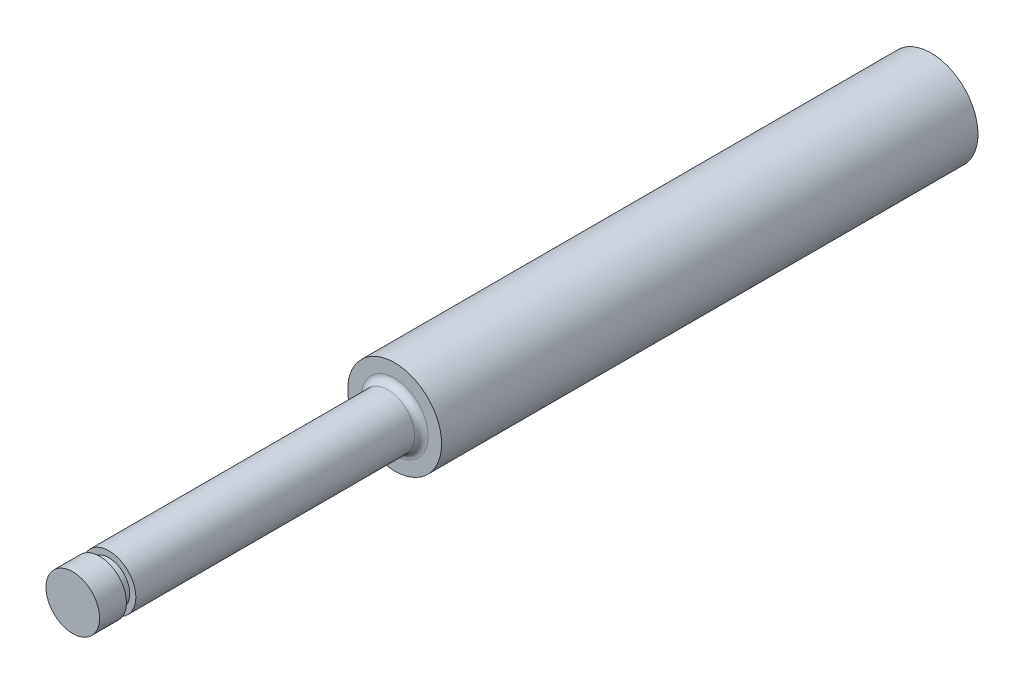
ISO-10303-21;
HEADER;
FILE_DESCRIPTION(('STEP AP214'),'2;1');
FILE_NAME('part.step','',(''),(''),'','','');
FILE_SCHEMA(('AUTOMOTIVE_DESIGN { 1 0 10303 214 1 1 1 1 }'));
ENDSEC;
DATA;
#1=APPLICATION_CONTEXT('core data for automotive mechanical design processes');
#2=APPLICATION_PROTOCOL_DEFINITION('international standard','automotive_design',2000,#1);
#3=PRODUCT_CONTEXT('',#1,'mechanical');
#4=PRODUCT('Part','Part','',(#3));
#5=PRODUCT_RELATED_PRODUCT_CATEGORY('part','',(#4));
#6=PRODUCT_DEFINITION_FORMATION('','',#4);
#7=PRODUCT_DEFINITION_CONTEXT('part definition',#1,'design');
#8=PRODUCT_DEFINITION('design','',#6,#7);
#9=PRODUCT_DEFINITION_SHAPE('','',#8);
#10=(LENGTH_UNIT() NAMED_UNIT(*) SI_UNIT(.MILLI.,.METRE.));
#11=(NAMED_UNIT(*) PLANE_ANGLE_UNIT() SI_UNIT($,.RADIAN.));
#12=(NAMED_UNIT(*) SI_UNIT($,.STERADIAN.) SOLID_ANGLE_UNIT());
#13=UNCERTAINTY_MEASURE_WITH_UNIT(LENGTH_MEASURE(1.E-05),#10,'distance_accuracy_value','');
#14=(GEOMETRIC_REPRESENTATION_CONTEXT(3) GLOBAL_UNCERTAINTY_ASSIGNED_CONTEXT((#13)) GLOBAL_UNIT_ASSIGNED_CONTEXT((#10,
#11,#12)) REPRESENTATION_CONTEXT('',''));
#15=CARTESIAN_POINT('',(0.,0.,0.));
#16=DIRECTION('',(0.,0.,1.));
#17=DIRECTION('',(1.,0.,0.));
#18=AXIS2_PLACEMENT_3D('',#15,#16,#17);
#19=CARTESIAN_POINT('',(0.,0.,0.));
#20=DIRECTION('',(0.,0.,1.));
#21=DIRECTION('',(1.,0.,0.));
#22=AXIS2_PLACEMENT_3D('',#19,#20,#21);
#23=PLANE('',#22);
#24=CARTESIAN_POINT('',(0.,0.,0.));
#25=DIRECTION('',(0.,0.,1.));
#26=DIRECTION('',(1.,0.,0.));
#27=AXIS2_PLACEMENT_3D('',#24,#25,#26);
#28=CIRCLE('',#27,3.5);
#29=CARTESIAN_POINT('',(3.5,0.,0.));
#30=VERTEX_POINT('',#29);
#31=EDGE_CURVE('E87',#30,#30,#28,.T.);
#32=ORIENTED_EDGE('',*,*,#31,.F.);
#33=EDGE_LOOP('',(#32));
#34=FACE_BOUND('',#33,.T.);
#35=CARTESIAN_POINT('',(0.,0.,0.));
#36=DIRECTION('',(0.,0.,-1.));
#37=DIRECTION('',(-1.,0.,0.));
#38=AXIS2_PLACEMENT_3D('',#35,#36,#37);
#39=CIRCLE('',#38,1.5);
#40=CARTESIAN_POINT('',(-1.5,0.,0.));
#41=VERTEX_POINT('',#40);
#42=EDGE_CURVE('E119',#41,#41,#39,.T.);
#43=ORIENTED_EDGE('',*,*,#42,.F.);
#44=EDGE_LOOP('',(#43));
#45=FACE_BOUND('',#44,.T.);
#46=ADVANCED_FACE('F30',(#34,#45),#23,.F.);
#47=CARTESIAN_POINT('',(0.,0.,61.3));
#48=DIRECTION('',(0.,0.,-1.));
#49=DIRECTION('',(-1.,0.,0.));
#50=AXIS2_PLACEMENT_3D('',#47,#48,#49);
#51=PLANE('',#50);
#52=CARTESIAN_POINT('',(0.,0.,61.3));
#53=DIRECTION('',(0.,0.,-1.));
#54=DIRECTION('',(-1.,0.,0.));
#55=AXIS2_PLACEMENT_3D('',#52,#53,#54);
#56=CIRCLE('',#55,2.);
#57=CARTESIAN_POINT('',(-2.,0.,61.3));
#58=VERTEX_POINT('',#57);
#59=EDGE_CURVE('E92',#58,#58,#56,.T.);
#60=ORIENTED_EDGE('',*,*,#59,.F.);
#61=EDGE_LOOP('',(#60));
#62=FACE_BOUND('',#61,.T.);
#63=CARTESIAN_POINT('',(0.,0.,61.3));
#64=DIRECTION('',(0.,0.,1.));
#65=DIRECTION('',(1.,0.,0.));
#66=AXIS2_PLACEMENT_3D('',#63,#64,#65);
#67=CIRCLE('',#66,1.55);
#68=CARTESIAN_POINT('',(1.55,0.,61.3));
#69=VERTEX_POINT('',#68);
#70=EDGE_CURVE('E86',#69,#69,#67,.T.);
#71=ORIENTED_EDGE('',*,*,#70,.F.);
#72=EDGE_LOOP('',(#71));
#73=FACE_BOUND('',#72,.T.);
#74=ADVANCED_FACE('F59',(#62,#73),#51,.F.);
#75=CARTESIAN_POINT('',(0.,0.,40.));
#76=DIRECTION('',(0.,0.,-1.));
#77=DIRECTION('',(-1.,0.,0.));
#78=AXIS2_PLACEMENT_3D('',#75,#76,#77);
#79=CYLINDRICAL_SURFACE('',#78,3.5);
#80=CARTESIAN_POINT('',(0.,0.,40.));
#81=DIRECTION('',(0.,0.,1.));
#82=DIRECTION('',(1.,0.,0.));
#83=AXIS2_PLACEMENT_3D('',#80,#81,#82);
#84=CIRCLE('',#83,3.5);
#85=CARTESIAN_POINT('',(3.5,0.,40.));
#86=VERTEX_POINT('',#85);
#87=EDGE_CURVE('E85',#86,#86,#84,.T.);
#88=ORIENTED_EDGE('',*,*,#87,.F.);
#89=EDGE_LOOP('',(#88));
#90=FACE_BOUND('',#89,.T.);
#91=ORIENTED_EDGE('',*,*,#31,.T.);
#92=EDGE_LOOP('',(#91));
#93=FACE_BOUND('',#92,.T.);
#94=ADVANCED_FACE('F32',(#90,#93),#79,.T.);
#95=CARTESIAN_POINT('',(0.,0.,40.));
#96=DIRECTION('',(0.,0.,1.));
#97=DIRECTION('',(1.,0.,0.));
#98=AXIS2_PLACEMENT_3D('',#95,#96,#97);
#99=PLANE('',#98);
#100=CARTESIAN_POINT('',(0.,0.,40.));
#101=DIRECTION('',(0.,0.,1.));
#102=DIRECTION('',(1.,0.,0.));
#103=AXIS2_PLACEMENT_3D('',#100,#101,#102);
#104=CIRCLE('',#103,2.5);
#105=CARTESIAN_POINT('',(2.5,0.,40.));
#106=VERTEX_POINT('',#105);
#107=EDGE_CURVE('E11',#106,#106,#104,.F.);
#108=ORIENTED_EDGE('',*,*,#107,.T.);
#109=EDGE_LOOP('',(#108));
#110=FACE_BOUND('',#109,.T.);
#111=ORIENTED_EDGE('',*,*,#87,.T.);
#112=EDGE_LOOP('',(#111));
#113=FACE_BOUND('',#112,.T.);
#114=ADVANCED_FACE('F67',(#110,#113),#99,.T.);
#115=CARTESIAN_POINT('',(0.,0.,61.3));
#116=DIRECTION('',(0.,0.,-1.));
#117=DIRECTION('',(-1.,0.,0.));
#118=AXIS2_PLACEMENT_3D('',#115,#116,#117);
#119=CYLINDRICAL_SURFACE('',#118,2.);
#120=CARTESIAN_POINT('',(0.,0.,40.5));
#121=DIRECTION('',(0.,0.,1.));
#122=DIRECTION('',(1.,0.,0.));
#123=AXIS2_PLACEMENT_3D('',#120,#121,#122);
#124=CIRCLE('',#123,2.);
#125=CARTESIAN_POINT('',(2.,0.,40.5));
#126=VERTEX_POINT('',#125);
#127=EDGE_CURVE('E37',#126,#126,#124,.T.);
#128=ORIENTED_EDGE('',*,*,#127,.T.);
#129=EDGE_LOOP('',(#128));
#130=FACE_BOUND('',#129,.T.);
#131=ORIENTED_EDGE('',*,*,#59,.T.);
#132=EDGE_LOOP('',(#131));
#133=FACE_BOUND('',#132,.T.);
#134=ADVANCED_FACE('F71',(#130,#133),#119,.T.);
#135=CARTESIAN_POINT('',(0.,0.,62.));
#136=DIRECTION('',(0.,0.,-1.));
#137=DIRECTION('',(-1.,0.,0.));
#138=AXIS2_PLACEMENT_3D('',#135,#136,#137);
#139=CYLINDRICAL_SURFACE('',#138,1.55);
#140=CARTESIAN_POINT('',(0.,0.,62.));
#141=DIRECTION('',(0.,0.,1.));
#142=DIRECTION('',(1.,0.,0.));
#143=AXIS2_PLACEMENT_3D('',#140,#141,#142);
#144=CIRCLE('',#143,1.55);
#145=CARTESIAN_POINT('',(1.55,0.,62.));
#146=VERTEX_POINT('',#145);
#147=EDGE_CURVE('E101',#146,#146,#144,.T.);
#148=ORIENTED_EDGE('',*,*,#147,.F.);
#149=EDGE_LOOP('',(#148));
#150=FACE_BOUND('',#149,.T.);
#151=ORIENTED_EDGE('',*,*,#70,.T.);
#152=EDGE_LOOP('',(#151));
#153=FACE_BOUND('',#152,.T.);
#154=ADVANCED_FACE('F78',(#150,#153),#139,.T.);
#155=CARTESIAN_POINT('',(0.,0.,62.));
#156=DIRECTION('',(0.,0.,1.));
#157=DIRECTION('',(1.,0.,0.));
#158=AXIS2_PLACEMENT_3D('',#155,#156,#157);
#159=PLANE('',#158);
#160=CARTESIAN_POINT('',(0.,0.,62.));
#161=DIRECTION('',(0.,0.,1.));
#162=DIRECTION('',(1.,0.,0.));
#163=AXIS2_PLACEMENT_3D('',#160,#161,#162);
#164=CIRCLE('',#163,2.);
#165=CARTESIAN_POINT('',(2.,0.,62.));
#166=VERTEX_POINT('',#165);
#167=EDGE_CURVE('E108',#166,#166,#164,.T.);
#168=ORIENTED_EDGE('',*,*,#167,.F.);
#169=EDGE_LOOP('',(#168));
#170=FACE_BOUND('',#169,.T.);
#171=ORIENTED_EDGE('',*,*,#147,.T.);
#172=EDGE_LOOP('',(#171));
#173=FACE_BOUND('',#172,.T.);
#174=ADVANCED_FACE('F175',(#170,#173),#159,.F.);
#175=CARTESIAN_POINT('',(0.,0.,64.));
#176=DIRECTION('',(0.,0.,-1.));
#177=DIRECTION('',(-1.,0.,0.));
#178=AXIS2_PLACEMENT_3D('',#175,#176,#177);
#179=CYLINDRICAL_SURFACE('',#178,2.);
#180=CARTESIAN_POINT('',(0.,0.,64.));
#181=DIRECTION('',(0.,0.,1.));
#182=DIRECTION('',(1.,0.,0.));
#183=AXIS2_PLACEMENT_3D('',#180,#181,#182);
#184=CIRCLE('',#183,2.);
#185=CARTESIAN_POINT('',(2.,0.,64.));
#186=VERTEX_POINT('',#185);
#187=EDGE_CURVE('E103',#186,#186,#184,.T.);
#188=ORIENTED_EDGE('',*,*,#187,.F.);
#189=EDGE_LOOP('',(#188));
#190=FACE_BOUND('',#189,.T.);
#191=ORIENTED_EDGE('',*,*,#167,.T.);
#192=EDGE_LOOP('',(#191));
#193=FACE_BOUND('',#192,.T.);
#194=ADVANCED_FACE('F56',(#190,#193),#179,.T.);
#195=CARTESIAN_POINT('',(0.,0.,64.));
#196=DIRECTION('',(0.,0.,1.));
#197=DIRECTION('',(1.,0.,0.));
#198=AXIS2_PLACEMENT_3D('',#195,#196,#197);
#199=PLANE('',#198);
#200=ORIENTED_EDGE('',*,*,#187,.T.);
#201=EDGE_LOOP('',(#200));
#202=FACE_BOUND('',#201,.T.);
#203=ADVANCED_FACE('F53',(#202),#199,.T.);
#204=CARTESIAN_POINT('',(0.,0.,40.5));
#205=DIRECTION('',(0.,0.,1.));
#206=DIRECTION('',(1.,0.,0.));
#207=AXIS2_PLACEMENT_3D('',#204,#205,#206);
#208=TOROIDAL_SURFACE('',#207,2.5,0.5);
#209=ORIENTED_EDGE('',*,*,#107,.F.);
#210=EDGE_LOOP('',(#209));
#211=FACE_BOUND('',#210,.T.);
#212=ORIENTED_EDGE('',*,*,#127,.F.);
#213=EDGE_LOOP('',(#212));
#214=FACE_BOUND('',#213,.T.);
#215=ADVANCED_FACE('F43',(#211,#214),#208,.F.);
#216=CARTESIAN_POINT('',(0.,0.,11.4330127018922));
#217=DIRECTION('',(0.,0.,-1.));
#218=DIRECTION('',(-1.,0.,0.));
#219=AXIS2_PLACEMENT_3D('',#216,#217,#218);
#220=CONICAL_SURFACE('',#219,0.,1.0471975511966);
#221=CARTESIAN_POINT('',(0.,0.,11.));
#222=DIRECTION('',(0.,0.,-1.));
#223=DIRECTION('',(-1.,0.,0.));
#224=AXIS2_PLACEMENT_3D('',#221,#222,#223);
#225=CIRCLE('',#224,0.75);
#226=CARTESIAN_POINT('',(-0.75,0.,11.));
#227=VERTEX_POINT('',#226);
#228=EDGE_CURVE('E111',#227,#227,#225,.T.);
#229=ORIENTED_EDGE('',*,*,#228,.T.);
#230=EDGE_LOOP('',(#229));
#231=FACE_BOUND('',#230,.T.);
#232=CARTESIAN_POINT('',(0.,0.,11.4330127018922));
#233=VERTEX_POINT('',#232);
#234=VERTEX_LOOP('',#233);
#235=FACE_BOUND('',#234,.T.);
#236=ADVANCED_FACE('F40',(#231,#235),#220,.F.);
#237=CARTESIAN_POINT('',(0.,0.,0.));
#238=DIRECTION('',(0.,0.,-1.));
#239=DIRECTION('',(-1.,0.,0.));
#240=AXIS2_PLACEMENT_3D('',#237,#238,#239);
#241=CYLINDRICAL_SURFACE('',#240,0.749999999999997);
#242=CARTESIAN_POINT('',(0.,0.,8.));
#243=DIRECTION('',(0.,0.,-1.));
#244=DIRECTION('',(-1.,0.,0.));
#245=AXIS2_PLACEMENT_3D('',#242,#243,#244);
#246=CIRCLE('',#245,0.749999999999994);
#247=CARTESIAN_POINT('',(-0.749999999999994,0.,8.));
#248=VERTEX_POINT('',#247);
#249=EDGE_CURVE('E113',#248,#248,#246,.T.);
#250=ORIENTED_EDGE('',*,*,#249,.T.);
#251=EDGE_LOOP('',(#250));
#252=FACE_BOUND('',#251,.T.);
#253=ORIENTED_EDGE('',*,*,#228,.F.);
#254=EDGE_LOOP('',(#253));
#255=FACE_BOUND('',#254,.T.);
#256=ADVANCED_FACE('F42',(#252,#255),#241,.F.);
#257=CARTESIAN_POINT('',(0.749999999999994,0.,8.));
#258=DIRECTION('',(0.,0.,-1.));
#259=DIRECTION('',(-1.,0.,0.));
#260=AXIS2_PLACEMENT_3D('',#257,#258,#259);
#261=PLANE('',#260);
#262=CARTESIAN_POINT('',(0.,0.,8.));
#263=DIRECTION('',(0.,0.,-1.));
#264=DIRECTION('',(-1.,0.,0.));
#265=AXIS2_PLACEMENT_3D('',#262,#263,#264);
#266=CIRCLE('',#265,1.5);
#267=CARTESIAN_POINT('',(-1.5,0.,8.));
#268=VERTEX_POINT('',#267);
#269=EDGE_CURVE('E116',#268,#268,#266,.T.);
#270=ORIENTED_EDGE('',*,*,#269,.T.);
#271=EDGE_LOOP('',(#270));
#272=FACE_BOUND('',#271,.T.);
#273=ORIENTED_EDGE('',*,*,#249,.F.);
#274=EDGE_LOOP('',(#273));
#275=FACE_BOUND('',#274,.T.);
#276=ADVANCED_FACE('F50',(#272,#275),#261,.T.);
#277=CARTESIAN_POINT('',(0.,0.,0.));
#278=DIRECTION('',(0.,0.,-1.));
#279=DIRECTION('',(-1.,0.,0.));
#280=AXIS2_PLACEMENT_3D('',#277,#278,#279);
#281=CYLINDRICAL_SURFACE('',#280,1.5);
#282=ORIENTED_EDGE('',*,*,#42,.T.);
#283=EDGE_LOOP('',(#282));
#284=FACE_BOUND('',#283,.T.);
#285=ORIENTED_EDGE('',*,*,#269,.F.);
#286=EDGE_LOOP('',(#285));
#287=FACE_BOUND('',#286,.T.);
#288=ADVANCED_FACE('F123',(#284,#287),#281,.F.);
#289=CLOSED_SHELL('',(#46,#74,#94,#114,#134,#154,#174,#194,#203,#215,#236,#256,#276,#288));
#290=MANIFOLD_SOLID_BREP('B2',#289);
#291=ADVANCED_BREP_SHAPE_REPRESENTATION('',(#18,#290),#14);
#292=SHAPE_DEFINITION_REPRESENTATION(#9,#291);
ENDSEC;
END-ISO-10303-21;
